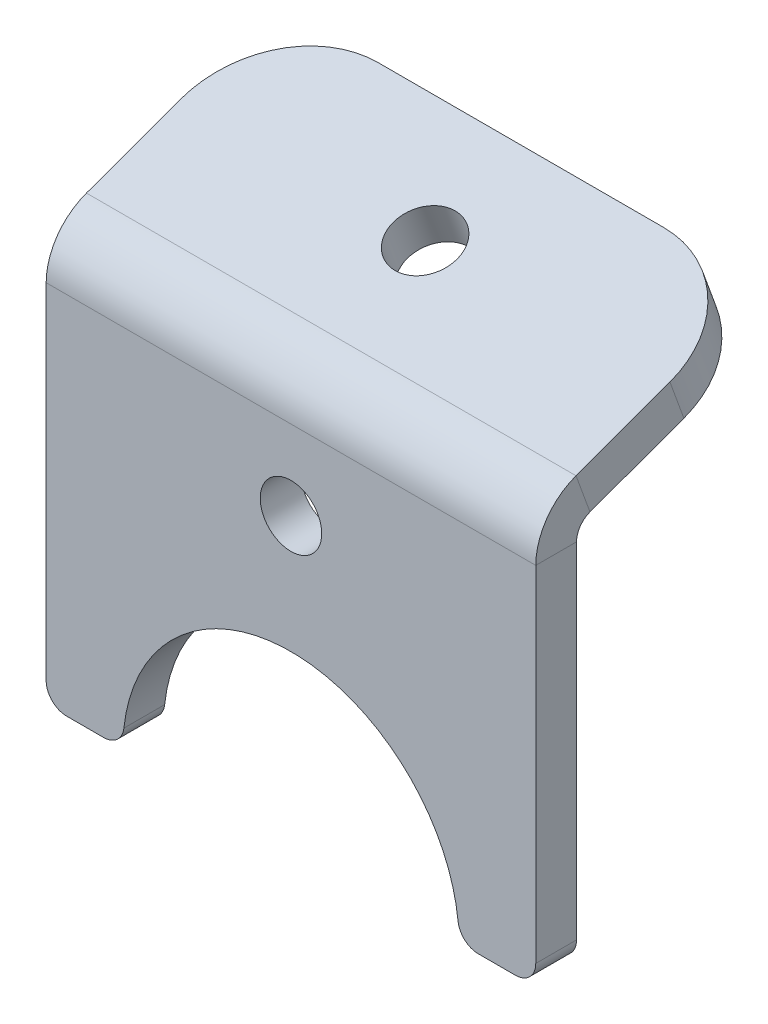
ISO-10303-21;
HEADER;
FILE_DESCRIPTION(('STEP AP214'),'2;1');
FILE_NAME('part.step','',(''),(''),'','','');
FILE_SCHEMA(('AUTOMOTIVE_DESIGN { 1 0 10303 214 1 1 1 1 }'));
ENDSEC;
DATA;
#1=APPLICATION_CONTEXT('core data for automotive mechanical design processes');
#2=APPLICATION_PROTOCOL_DEFINITION('international standard','automotive_design',2000,#1);
#3=PRODUCT_CONTEXT('',#1,'mechanical');
#4=PRODUCT('Part','Part','',(#3));
#5=PRODUCT_RELATED_PRODUCT_CATEGORY('part','',(#4));
#6=PRODUCT_DEFINITION_FORMATION('','',#4);
#7=PRODUCT_DEFINITION_CONTEXT('part definition',#1,'design');
#8=PRODUCT_DEFINITION('design','',#6,#7);
#9=PRODUCT_DEFINITION_SHAPE('','',#8);
#10=(LENGTH_UNIT() NAMED_UNIT(*) SI_UNIT(.MILLI.,.METRE.));
#11=(NAMED_UNIT(*) PLANE_ANGLE_UNIT() SI_UNIT($,.RADIAN.));
#12=(NAMED_UNIT(*) SI_UNIT($,.STERADIAN.) SOLID_ANGLE_UNIT());
#13=UNCERTAINTY_MEASURE_WITH_UNIT(LENGTH_MEASURE(1.E-05),#10,'distance_accuracy_value','');
#14=(GEOMETRIC_REPRESENTATION_CONTEXT(3) GLOBAL_UNCERTAINTY_ASSIGNED_CONTEXT((#13)) GLOBAL_UNIT_ASSIGNED_CONTEXT((#10,
#11,#12)) REPRESENTATION_CONTEXT('',''));
#15=CARTESIAN_POINT('',(0.,0.,0.));
#16=DIRECTION('',(0.,0.,1.));
#17=DIRECTION('',(1.,0.,0.));
#18=AXIS2_PLACEMENT_3D('',#15,#16,#17);
#19=CARTESIAN_POINT('',(38.1,0.,-6.35));
#20=DIRECTION('',(0.,-1.,0.));
#21=DIRECTION('',(0.,0.,-1.));
#22=AXIS2_PLACEMENT_3D('',#19,#20,#21);
#23=PLANE('',#22);
#24=DIRECTION('',(-1.,0.,0.));
#25=VECTOR('',#24,1.);
#26=CARTESIAN_POINT('',(38.1,0.,0.));
#27=LINE('',#26,#25);
#28=CARTESIAN_POINT('',(34.925,0.,0.));
#29=VERTEX_POINT('',#28);
#30=CARTESIAN_POINT('',(29.1646865918357,0.,0.));
#31=VERTEX_POINT('',#30);
#32=EDGE_CURVE('E225',#29,#31,#27,.T.);
#33=ORIENTED_EDGE('',*,*,#32,.T.);
#34=DIRECTION('',(0.,0.,-1.));
#35=VECTOR('',#34,1.);
#36=CARTESIAN_POINT('',(29.1646865918357,0.,-6.34999999999999));
#37=LINE('',#36,#35);
#38=CARTESIAN_POINT('',(29.1646865918357,0.,-6.35));
#39=VERTEX_POINT('',#38);
#40=EDGE_CURVE('E46',#31,#39,#37,.T.);
#41=ORIENTED_EDGE('',*,*,#40,.T.);
#42=DIRECTION('',(-1.,0.,0.));
#43=VECTOR('',#42,1.);
#44=CARTESIAN_POINT('',(38.1,0.,-6.35));
#45=LINE('',#44,#43);
#46=CARTESIAN_POINT('',(34.925,0.,-6.35));
#47=VERTEX_POINT('',#46);
#48=EDGE_CURVE('E222',#47,#39,#45,.T.);
#49=ORIENTED_EDGE('',*,*,#48,.F.);
#50=DIRECTION('',(0.,0.,1.));
#51=VECTOR('',#50,1.);
#52=CARTESIAN_POINT('',(34.925,0.,-6.35));
#53=LINE('',#52,#51);
#54=EDGE_CURVE('E286',#47,#29,#53,.T.);
#55=ORIENTED_EDGE('',*,*,#54,.T.);
#56=EDGE_LOOP('',(#33,#41,#49,#55));
#57=FACE_BOUND('',#56,.T.);
#58=ADVANCED_FACE('F38',(#57),#23,.T.);
#59=CARTESIAN_POINT('',(38.1,65.7810954115383,-6.26725813482301));
#60=DIRECTION('',(1.,0.,0.));
#61=DIRECTION('',(0.,0.,-1.));
#62=AXIS2_PLACEMENT_3D('',#59,#60,#61);
#63=PLANE('',#62);
#64=DIRECTION('',(0.,-0.939692620785909,-0.342020143325667));
#65=VECTOR('',#64,1.);
#66=CARTESIAN_POINT('',(38.1,65.7810954115383,-6.26725813482301));
#67=LINE('',#66,#65);
#68=CARTESIAN_POINT('',(38.1,65.7810954115383,-6.26725813482301));
#69=VERTEX_POINT('',#68);
#70=CARTESIAN_POINT('',(38.1,59.8140472695477,-8.439086044941));
#71=VERTEX_POINT('',#70);
#72=EDGE_CURVE('E163',#69,#71,#67,.T.);
#73=ORIENTED_EDGE('',*,*,#72,.F.);
#74=CARTESIAN_POINT('',(38.1,56.8305231985525,-9.525));
#75=DIRECTION('',(-1.,0.,0.));
#76=DIRECTION('',(0.,0.,1.));
#77=AXIS2_PLACEMENT_3D('',#74,#75,#76);
#78=CIRCLE('',#77,9.525);
#79=CARTESIAN_POINT('',(38.1,56.8305231985525,0.));
#80=VERTEX_POINT('',#79);
#81=EDGE_CURVE('E158',#69,#80,#78,.F.);
#82=ORIENTED_EDGE('',*,*,#81,.T.);
#83=DIRECTION('',(0.,0.,1.));
#84=VECTOR('',#83,1.);
#85=CARTESIAN_POINT('',(38.1,56.8305231985525,-6.35));
#86=LINE('',#85,#84);
#87=CARTESIAN_POINT('',(38.1,56.8305231985525,-6.35));
#88=VERTEX_POINT('',#87);
#89=EDGE_CURVE('E151',#88,#80,#86,.T.);
#90=ORIENTED_EDGE('',*,*,#89,.F.);
#91=CARTESIAN_POINT('',(38.1,56.8305231985525,-9.525));
#92=DIRECTION('',(1.,0.,0.));
#93=DIRECTION('',(0.,0.,-1.));
#94=AXIS2_PLACEMENT_3D('',#91,#92,#93);
#95=CIRCLE('',#94,3.175);
#96=EDGE_CURVE('E156',#71,#88,#95,.T.);
#97=ORIENTED_EDGE('',*,*,#96,.F.);
#98=EDGE_LOOP('',(#73,#82,#90,#97));
#99=FACE_BOUND('',#98,.T.);
#100=ADVANCED_FACE('F154',(#99),#63,.T.);
#101=CARTESIAN_POINT('',(38.1,56.8305231985525,-6.35));
#102=DIRECTION('',(1.,0.,0.));
#103=DIRECTION('',(0.,0.,-1.));
#104=AXIS2_PLACEMENT_3D('',#101,#102,#103);
#105=PLANE('',#104);
#106=DIRECTION('',(0.,-0.342020143325666,0.93969262078591));
#107=VECTOR('',#106,1.);
#108=CARTESIAN_POINT('',(38.1,70.5639193187174,-37.9741167620611));
#109=LINE('',#108,#107);
#110=CARTESIAN_POINT('',(38.1,65.1343495434224,-23.0564964070848));
#111=VERTEX_POINT('',#110);
#112=EDGE_CURVE('E187',#111,#71,#109,.T.);
#113=ORIENTED_EDGE('',*,*,#112,.F.);
#114=DIRECTION('',(0.,-0.93969262078591,-0.342020143325666));
#115=VECTOR('',#114,1.);
#116=CARTESIAN_POINT('',(38.1,63.1712508028045,-23.7710059155952));
#117=LINE('',#116,#115);
#118=CARTESIAN_POINT('',(38.1,71.1013976854129,-20.8846684969668));
#119=VERTEX_POINT('',#118);
#120=EDGE_CURVE('E256',#111,#119,#117,.F.);
#121=ORIENTED_EDGE('',*,*,#120,.T.);
#122=DIRECTION('',(0.,-0.342020143325666,0.93969262078591));
#123=VECTOR('',#122,1.);
#124=CARTESIAN_POINT('',(38.1,76.5309674607079,-35.8022888519431));
#125=LINE('',#124,#123);
#126=EDGE_CURVE('E189',#119,#69,#125,.T.);
#127=ORIENTED_EDGE('',*,*,#126,.T.);
#128=ORIENTED_EDGE('',*,*,#72,.T.);
#129=EDGE_LOOP('',(#113,#121,#127,#128));
#130=FACE_BOUND('',#129,.T.);
#131=ADVANCED_FACE('F366',(#130),#105,.T.);
#132=CARTESIAN_POINT('',(-38.1,56.8305231985525,0.));
#133=DIRECTION('',(-1.,0.,0.));
#134=DIRECTION('',(0.,0.,1.));
#135=AXIS2_PLACEMENT_3D('',#132,#133,#134);
#136=PLANE('',#135);
#137=DIRECTION('',(0.,0.,-1.));
#138=VECTOR('',#137,1.);
#139=CARTESIAN_POINT('',(-38.1,56.8305231985525,0.));
#140=LINE('',#139,#138);
#141=CARTESIAN_POINT('',(-38.1,56.8305231985525,0.));
#142=VERTEX_POINT('',#141);
#143=CARTESIAN_POINT('',(-38.1,56.8305231985525,-6.35));
#144=VERTEX_POINT('',#143);
#145=EDGE_CURVE('E164',#142,#144,#140,.T.);
#146=ORIENTED_EDGE('',*,*,#145,.F.);
#147=CARTESIAN_POINT('',(-38.1,56.8305231985525,-9.525));
#148=DIRECTION('',(-1.,0.,0.));
#149=DIRECTION('',(0.,0.,1.));
#150=AXIS2_PLACEMENT_3D('',#147,#148,#149);
#151=CIRCLE('',#150,9.525);
#152=CARTESIAN_POINT('',(-38.1,65.7810954115383,-6.26725813482301));
#153=VERTEX_POINT('',#152);
#154=EDGE_CURVE('E207',#153,#142,#151,.F.);
#155=ORIENTED_EDGE('',*,*,#154,.F.);
#156=DIRECTION('',(0.,0.939692620785909,0.342020143325667));
#157=VECTOR('',#156,1.);
#158=CARTESIAN_POINT('',(-38.1,59.8140472695477,-8.439086044941));
#159=LINE('',#158,#157);
#160=CARTESIAN_POINT('',(-38.1,59.8140472695477,-8.439086044941));
#161=VERTEX_POINT('',#160);
#162=EDGE_CURVE('E227',#161,#153,#159,.T.);
#163=ORIENTED_EDGE('',*,*,#162,.F.);
#164=CARTESIAN_POINT('',(-38.1,56.8305231985525,-9.525));
#165=DIRECTION('',(1.,0.,0.));
#166=DIRECTION('',(0.,0.,-1.));
#167=AXIS2_PLACEMENT_3D('',#164,#165,#166);
#168=CIRCLE('',#167,3.175);
#169=EDGE_CURVE('E201',#161,#144,#168,.T.);
#170=ORIENTED_EDGE('',*,*,#169,.T.);
#171=EDGE_LOOP('',(#146,#155,#163,#170));
#172=FACE_BOUND('',#171,.T.);
#173=ADVANCED_FACE('F323',(#172),#136,.T.);
#174=CARTESIAN_POINT('',(-38.1,59.8140472695477,-8.439086044941));
#175=DIRECTION('',(-1.,0.,0.));
#176=DIRECTION('',(0.,0.,1.));
#177=AXIS2_PLACEMENT_3D('',#174,#175,#176);
#178=PLANE('',#177);
#179=DIRECTION('',(0.,-1.,0.));
#180=VECTOR('',#179,1.);
#181=CARTESIAN_POINT('',(-38.1,63.5,-6.35));
#182=LINE('',#181,#180);
#183=CARTESIAN_POINT('',(-38.1,3.175,-6.35));
#184=VERTEX_POINT('',#183);
#185=EDGE_CURVE('E173',#144,#184,#182,.T.);
#186=ORIENTED_EDGE('',*,*,#185,.T.);
#187=DIRECTION('',(0.,0.,1.));
#188=VECTOR('',#187,1.);
#189=CARTESIAN_POINT('',(-38.1,3.175,-8.439086044941));
#190=LINE('',#189,#188);
#191=CARTESIAN_POINT('',(-38.1,3.175,0.));
#192=VERTEX_POINT('',#191);
#193=EDGE_CURVE('E258',#184,#192,#190,.T.);
#194=ORIENTED_EDGE('',*,*,#193,.T.);
#195=DIRECTION('',(0.,-1.,0.));
#196=VECTOR('',#195,1.);
#197=CARTESIAN_POINT('',(-38.1,63.5,0.));
#198=LINE('',#197,#196);
#199=EDGE_CURVE('E196',#142,#192,#198,.T.);
#200=ORIENTED_EDGE('',*,*,#199,.F.);
#201=ORIENTED_EDGE('',*,*,#145,.T.);
#202=EDGE_LOOP('',(#186,#194,#200,#201));
#203=FACE_BOUND('',#202,.T.);
#204=ADVANCED_FACE('F319',(#203),#178,.T.);
#205=CARTESIAN_POINT('',(38.1,63.5,0.));
#206=DIRECTION('',(0.,0.,-1.));
#207=DIRECTION('',(0.,1.,0.));
#208=AXIS2_PLACEMENT_3D('',#205,#206,#207);
#209=PLANE('',#208);
#210=CARTESIAN_POINT('',(0.,44.45,0.));
#211=DIRECTION('',(0.,0.,1.));
#212=DIRECTION('',(1.,0.,0.));
#213=AXIS2_PLACEMENT_3D('',#210,#211,#212);
#214=CIRCLE('',#213,4.7879);
#215=CARTESIAN_POINT('',(4.7879,44.45,0.));
#216=VERTEX_POINT('',#215);
#217=EDGE_CURVE('E240',#216,#216,#214,.T.);
#218=ORIENTED_EDGE('',*,*,#217,.F.);
#219=EDGE_LOOP('',(#218));
#220=FACE_BOUND('',#219,.T.);
#221=ORIENTED_EDGE('',*,*,#199,.T.);
#222=CARTESIAN_POINT('',(-34.925,3.175,0.));
#223=DIRECTION('',(0.,0.,-1.));
#224=DIRECTION('',(0.,1.,0.));
#225=AXIS2_PLACEMENT_3D('',#222,#223,#224);
#226=CIRCLE('',#225,3.175);
#227=CARTESIAN_POINT('',(-34.925,0.,0.));
#228=VERTEX_POINT('',#227);
#229=EDGE_CURVE('E267',#192,#228,#226,.F.);
#230=ORIENTED_EDGE('',*,*,#229,.T.);
#231=CARTESIAN_POINT('',(-29.1646865918357,0.,0.));
#232=VERTEX_POINT('',#231);
#233=EDGE_CURVE('E224',#232,#228,#27,.T.);
#234=ORIENTED_EDGE('',*,*,#233,.F.);
#235=CARTESIAN_POINT('',(-29.1646865918357,3.175,0.));
#236=DIRECTION('',(0.,0.,-1.));
#237=DIRECTION('',(0.,1.,0.));
#238=AXIS2_PLACEMENT_3D('',#235,#236,#237);
#239=CIRCLE('',#238,3.175);
#240=CARTESIAN_POINT('',(-26.0083352290829,2.83138528138528,0.));
#241=VERTEX_POINT('',#240);
#242=EDGE_CURVE('E265',#232,#241,#239,.F.);
#243=ORIENTED_EDGE('',*,*,#242,.T.);
#244=CARTESIAN_POINT('',(0.,0.,0.));
#245=DIRECTION('',(0.,0.,1.));
#246=DIRECTION('',(1.,0.,0.));
#247=AXIS2_PLACEMENT_3D('',#244,#245,#246);
#248=CIRCLE('',#247,26.162);
#249=CARTESIAN_POINT('',(26.0083352290829,2.83138528138528,0.));
#250=VERTEX_POINT('',#249);
#251=EDGE_CURVE('E199',#250,#241,#248,.T.);
#252=ORIENTED_EDGE('',*,*,#251,.F.);
#253=CARTESIAN_POINT('',(29.1646865918357,3.175,0.));
#254=DIRECTION('',(0.,0.,-1.));
#255=DIRECTION('',(0.,1.,0.));
#256=AXIS2_PLACEMENT_3D('',#253,#254,#255);
#257=CIRCLE('',#256,3.175);
#258=EDGE_CURVE('E263',#250,#31,#257,.F.);
#259=ORIENTED_EDGE('',*,*,#258,.T.);
#260=ORIENTED_EDGE('',*,*,#32,.F.);
#261=CARTESIAN_POINT('',(34.925,3.175,0.));
#262=DIRECTION('',(0.,0.,-1.));
#263=DIRECTION('',(0.,1.,0.));
#264=AXIS2_PLACEMENT_3D('',#261,#262,#263);
#265=CIRCLE('',#264,3.175);
#266=CARTESIAN_POINT('',(38.1,3.175,0.));
#267=VERTEX_POINT('',#266);
#268=EDGE_CURVE('E261',#29,#267,#265,.F.);
#269=ORIENTED_EDGE('',*,*,#268,.T.);
#270=DIRECTION('',(0.,-1.,0.));
#271=VECTOR('',#270,1.);
#272=CARTESIAN_POINT('',(38.1,63.5,0.));
#273=LINE('',#272,#271);
#274=EDGE_CURVE('E182',#80,#267,#273,.T.);
#275=ORIENTED_EDGE('',*,*,#274,.F.);
#276=DIRECTION('',(-1.,0.,0.));
#277=VECTOR('',#276,1.);
#278=CARTESIAN_POINT('',(38.1,56.8305231985525,0.));
#279=LINE('',#278,#277);
#280=EDGE_CURVE('E195',#80,#142,#279,.T.);
#281=ORIENTED_EDGE('',*,*,#280,.T.);
#282=EDGE_LOOP('',(#221,#230,#234,#243,#252,#259,#260,#269,#275,#281));
#283=FACE_BOUND('',#282,.T.);
#284=ADVANCED_FACE('F292',(#220,#283),#209,.F.);
#285=ORIENTED_EDGE('',*,*,#233,.T.);
#286=DIRECTION('',(0.,0.,1.));
#287=VECTOR('',#286,1.);
#288=CARTESIAN_POINT('',(-34.925,0.,-6.35));
#289=LINE('',#288,#287);
#290=CARTESIAN_POINT('',(-34.925,0.,-6.35));
#291=VERTEX_POINT('',#290);
#292=EDGE_CURVE('E271',#228,#291,#289,.F.);
#293=ORIENTED_EDGE('',*,*,#292,.T.);
#294=CARTESIAN_POINT('',(-29.1646865918357,0.,-6.35));
#295=VERTEX_POINT('',#294);
#296=EDGE_CURVE('E177',#295,#291,#45,.T.);
#297=ORIENTED_EDGE('',*,*,#296,.F.);
#298=DIRECTION('',(0.,0.,-1.));
#299=VECTOR('',#298,1.);
#300=CARTESIAN_POINT('',(-29.1646865918357,0.,0.));
#301=LINE('',#300,#299);
#302=EDGE_CURVE('E269',#295,#232,#301,.F.);
#303=ORIENTED_EDGE('',*,*,#302,.T.);
#304=EDGE_LOOP('',(#285,#293,#297,#303));
#305=FACE_BOUND('',#304,.T.);
#306=ADVANCED_FACE('F310',(#305),#23,.T.);
#307=CARTESIAN_POINT('',(38.1,63.5,-6.35));
#308=DIRECTION('',(0.,0.,-1.));
#309=DIRECTION('',(0.,1.,0.));
#310=AXIS2_PLACEMENT_3D('',#307,#308,#309);
#311=PLANE('',#310);
#312=CARTESIAN_POINT('',(0.,44.45,-6.34999999999999));
#313=DIRECTION('',(0.,0.,-1.));
#314=DIRECTION('',(0.,1.,0.));
#315=AXIS2_PLACEMENT_3D('',#312,#313,#314);
#316=CIRCLE('',#315,4.7879);
#317=CARTESIAN_POINT('',(0.,49.2379,-6.34999999999999));
#318=VERTEX_POINT('',#317);
#319=EDGE_CURVE('E237',#318,#318,#316,.T.);
#320=ORIENTED_EDGE('',*,*,#319,.F.);
#321=EDGE_LOOP('',(#320));
#322=FACE_BOUND('',#321,.T.);
#323=ORIENTED_EDGE('',*,*,#296,.T.);
#324=CARTESIAN_POINT('',(-34.925,3.175,-6.35));
#325=DIRECTION('',(0.,0.,-1.));
#326=DIRECTION('',(0.,1.,0.));
#327=AXIS2_PLACEMENT_3D('',#324,#325,#326);
#328=CIRCLE('',#327,3.175);
#329=EDGE_CURVE('E278',#291,#184,#328,.T.);
#330=ORIENTED_EDGE('',*,*,#329,.T.);
#331=ORIENTED_EDGE('',*,*,#185,.F.);
#332=DIRECTION('',(-1.,0.,0.));
#333=VECTOR('',#332,1.);
#334=CARTESIAN_POINT('',(38.1,56.8305231985525,-6.35));
#335=LINE('',#334,#333);
#336=EDGE_CURVE('E168',#88,#144,#335,.T.);
#337=ORIENTED_EDGE('',*,*,#336,.F.);
#338=DIRECTION('',(0.,-1.,0.));
#339=VECTOR('',#338,1.);
#340=CARTESIAN_POINT('',(38.1,63.5,-6.35));
#341=LINE('',#340,#339);
#342=CARTESIAN_POINT('',(38.1,3.175,-6.35));
#343=VERTEX_POINT('',#342);
#344=EDGE_CURVE('E171',#88,#343,#341,.T.);
#345=ORIENTED_EDGE('',*,*,#344,.T.);
#346=CARTESIAN_POINT('',(34.925,3.175,-6.35));
#347=DIRECTION('',(0.,0.,-1.));
#348=DIRECTION('',(0.,1.,0.));
#349=AXIS2_PLACEMENT_3D('',#346,#347,#348);
#350=CIRCLE('',#349,3.175);
#351=EDGE_CURVE('E59',#343,#47,#350,.T.);
#352=ORIENTED_EDGE('',*,*,#351,.T.);
#353=ORIENTED_EDGE('',*,*,#48,.T.);
#354=CARTESIAN_POINT('',(29.1646865918357,3.175,-6.34999999999999));
#355=DIRECTION('',(0.,0.,-1.));
#356=DIRECTION('',(0.,1.,0.));
#357=AXIS2_PLACEMENT_3D('',#354,#355,#356);
#358=CIRCLE('',#357,3.175);
#359=CARTESIAN_POINT('',(26.0083352290829,2.83138528138528,-6.34999999999999));
#360=VERTEX_POINT('',#359);
#361=EDGE_CURVE('E274',#39,#360,#358,.T.);
#362=ORIENTED_EDGE('',*,*,#361,.T.);
#363=CARTESIAN_POINT('',(0.,0.,-6.34999999999999));
#364=DIRECTION('',(0.,0.,-1.));
#365=DIRECTION('',(0.,1.,0.));
#366=AXIS2_PLACEMENT_3D('',#363,#364,#365);
#367=CIRCLE('',#366,26.162);
#368=CARTESIAN_POINT('',(-26.0083352290829,2.83138528138528,-6.34999999999999));
#369=VERTEX_POINT('',#368);
#370=EDGE_CURVE('E233',#369,#360,#367,.T.);
#371=ORIENTED_EDGE('',*,*,#370,.F.);
#372=CARTESIAN_POINT('',(-29.1646865918357,3.175,-6.34999999999999));
#373=DIRECTION('',(0.,0.,-1.));
#374=DIRECTION('',(0.,1.,0.));
#375=AXIS2_PLACEMENT_3D('',#372,#373,#374);
#376=CIRCLE('',#375,3.175);
#377=EDGE_CURVE('E276',#369,#295,#376,.T.);
#378=ORIENTED_EDGE('',*,*,#377,.T.);
#379=EDGE_LOOP('',(#323,#330,#331,#337,#345,#352,#353,#362,#371,#378));
#380=FACE_BOUND('',#379,.T.);
#381=ADVANCED_FACE('F170',(#322,#380),#311,.T.);
#382=CARTESIAN_POINT('',(38.1,56.8305231985525,-9.525));
#383=DIRECTION('',(-1.,0.,0.));
#384=DIRECTION('',(0.,0.,1.));
#385=AXIS2_PLACEMENT_3D('',#382,#383,#384);
#386=CYLINDRICAL_SURFACE('',#385,3.175);
#387=ORIENTED_EDGE('',*,*,#169,.F.);
#388=DIRECTION('',(-1.,0.,0.));
#389=VECTOR('',#388,1.);
#390=CARTESIAN_POINT('',(38.1,59.8140472695477,-8.439086044941));
#391=LINE('',#390,#389);
#392=EDGE_CURVE('E178',#71,#161,#391,.T.);
#393=ORIENTED_EDGE('',*,*,#392,.F.);
#394=ORIENTED_EDGE('',*,*,#96,.T.);
#395=ORIENTED_EDGE('',*,*,#336,.T.);
#396=EDGE_LOOP('',(#387,#393,#394,#395));
#397=FACE_BOUND('',#396,.T.);
#398=ADVANCED_FACE('F185',(#397),#386,.F.);
#399=CARTESIAN_POINT('',(38.1,70.5639193187174,-37.9741167620611));
#400=DIRECTION('',(0.,-0.939692620785909,-0.342020143325666));
#401=DIRECTION('',(0.,0.342020143325666,-0.93969262078591));
#402=AXIS2_PLACEMENT_3D('',#399,#400,#401);
#403=PLANE('',#402);
#404=CARTESIAN_POINT('',(0.,65.1343495434224,-23.0564964070848));
#405=DIRECTION('',(0.,-0.939692620785909,-0.342020143325666));
#406=DIRECTION('',(0.,0.342020143325666,-0.93969262078591));
#407=AXIS2_PLACEMENT_3D('',#404,#405,#406);
#408=CIRCLE('',#407,4.9657);
#409=CARTESIAN_POINT('',(0.,66.8327189691347,-27.7227280541214));
#410=VERTEX_POINT('',#409);
#411=EDGE_CURVE('E332',#410,#410,#408,.T.);
#412=ORIENTED_EDGE('',*,*,#411,.F.);
#413=EDGE_LOOP('',(#412));
#414=FACE_BOUND('',#413,.T.);
#415=DIRECTION('',(0.,-0.342020143325666,0.93969262078591));
#416=VECTOR('',#415,1.);
#417=CARTESIAN_POINT('',(-38.1,70.5639193187174,-37.9741167620611));
#418=LINE('',#417,#416);
#419=CARTESIAN_POINT('',(-38.1,65.1343495434224,-23.0564964070848));
#420=VERTEX_POINT('',#419);
#421=EDGE_CURVE('E203',#420,#161,#418,.T.);
#422=ORIENTED_EDGE('',*,*,#421,.F.);
#423=CARTESIAN_POINT('',(-22.225,65.1343495434224,-23.0564964070848));
#424=DIRECTION('',(0.,-0.939692620785909,-0.342020143325666));
#425=DIRECTION('',(0.,0.342020143325666,-0.93969262078591));
#426=AXIS2_PLACEMENT_3D('',#423,#424,#425);
#427=CIRCLE('',#426,15.875);
#428=CARTESIAN_POINT('',(-22.225,70.5639193187174,-37.9741167620611));
#429=VERTEX_POINT('',#428);
#430=EDGE_CURVE('E245',#420,#429,#427,.T.);
#431=ORIENTED_EDGE('',*,*,#430,.T.);
#432=DIRECTION('',(-1.,0.,0.));
#433=VECTOR('',#432,1.);
#434=CARTESIAN_POINT('',(38.1,70.5639193187174,-37.9741167620611));
#435=LINE('',#434,#433);
#436=CARTESIAN_POINT('',(22.225,70.5639193187174,-37.9741167620611));
#437=VERTEX_POINT('',#436);
#438=EDGE_CURVE('E218',#437,#429,#435,.T.);
#439=ORIENTED_EDGE('',*,*,#438,.F.);
#440=CARTESIAN_POINT('',(22.225,65.1343495434224,-23.0564964070848));
#441=DIRECTION('',(0.,-0.939692620785909,-0.342020143325666));
#442=DIRECTION('',(0.,0.342020143325666,-0.93969262078591));
#443=AXIS2_PLACEMENT_3D('',#440,#441,#442);
#444=CIRCLE('',#443,15.875);
#445=EDGE_CURVE('E243',#437,#111,#444,.T.);
#446=ORIENTED_EDGE('',*,*,#445,.T.);
#447=ORIENTED_EDGE('',*,*,#112,.T.);
#448=ORIENTED_EDGE('',*,*,#392,.T.);
#449=EDGE_LOOP('',(#422,#431,#439,#446,#447,#448));
#450=FACE_BOUND('',#449,.T.);
#451=ADVANCED_FACE('F361',(#414,#450),#403,.T.);
#452=CARTESIAN_POINT('',(38.1,76.5309674607079,-35.8022888519431));
#453=DIRECTION('',(0.,0.342020143325666,-0.93969262078591));
#454=DIRECTION('',(0.,0.93969262078591,0.342020143325666));
#455=AXIS2_PLACEMENT_3D('',#452,#453,#454);
#456=PLANE('',#455);
#457=ORIENTED_EDGE('',*,*,#438,.T.);
#458=DIRECTION('',(0.,-0.93969262078591,-0.342020143325666));
#459=VECTOR('',#458,1.);
#460=CARTESIAN_POINT('',(-22.225,76.5309674607079,-35.8022888519431));
#461=LINE('',#460,#459);
#462=CARTESIAN_POINT('',(-22.225,76.5309674607079,-35.8022888519431));
#463=VERTEX_POINT('',#462);
#464=EDGE_CURVE('E250',#429,#463,#461,.F.);
#465=ORIENTED_EDGE('',*,*,#464,.T.);
#466=DIRECTION('',(-1.,0.,0.));
#467=VECTOR('',#466,1.);
#468=CARTESIAN_POINT('',(38.1,76.5309674607079,-35.8022888519431));
#469=LINE('',#468,#467);
#470=CARTESIAN_POINT('',(22.225,76.5309674607079,-35.8022888519431));
#471=VERTEX_POINT('',#470);
#472=EDGE_CURVE('E215',#471,#463,#469,.T.);
#473=ORIENTED_EDGE('',*,*,#472,.F.);
#474=DIRECTION('',(0.,-0.93969262078591,-0.342020143325666));
#475=VECTOR('',#474,1.);
#476=CARTESIAN_POINT('',(22.225,76.5309674607079,-35.8022888519431));
#477=LINE('',#476,#475);
#478=EDGE_CURVE('E247',#471,#437,#477,.T.);
#479=ORIENTED_EDGE('',*,*,#478,.T.);
#480=EDGE_LOOP('',(#457,#465,#473,#479));
#481=FACE_BOUND('',#480,.T.);
#482=ADVANCED_FACE('F344',(#481),#456,.T.);
#483=CARTESIAN_POINT('',(38.1,76.5309674607079,-35.8022888519431));
#484=DIRECTION('',(0.,-0.939692620785909,-0.342020143325666));
#485=DIRECTION('',(0.,0.342020143325666,-0.93969262078591));
#486=AXIS2_PLACEMENT_3D('',#483,#484,#485);
#487=PLANE('',#486);
#488=CARTESIAN_POINT('',(0.,71.1013976854129,-20.8846684969668));
#489=DIRECTION('',(0.,0.939692620785909,0.342020143325666));
#490=DIRECTION('',(0.,-0.342020143325666,0.939692620785909));
#491=AXIS2_PLACEMENT_3D('',#488,#489,#490);
#492=CIRCLE('',#491,4.9657);
#493=CARTESIAN_POINT('',(0.,69.4030282597007,-16.2184368499302));
#494=VERTEX_POINT('',#493);
#495=EDGE_CURVE('E335',#494,#494,#492,.T.);
#496=ORIENTED_EDGE('',*,*,#495,.F.);
#497=EDGE_LOOP('',(#496));
#498=FACE_BOUND('',#497,.T.);
#499=ORIENTED_EDGE('',*,*,#472,.T.);
#500=CARTESIAN_POINT('',(-22.225,71.1013976854129,-20.8846684969668));
#501=DIRECTION('',(0.,-0.939692620785909,-0.342020143325666));
#502=DIRECTION('',(0.,0.342020143325666,-0.93969262078591));
#503=AXIS2_PLACEMENT_3D('',#500,#501,#502);
#504=CIRCLE('',#503,15.875);
#505=CARTESIAN_POINT('',(-38.1,71.1013976854129,-20.8846684969668));
#506=VERTEX_POINT('',#505);
#507=EDGE_CURVE('E254',#463,#506,#504,.F.);
#508=ORIENTED_EDGE('',*,*,#507,.T.);
#509=DIRECTION('',(0.,-0.342020143325666,0.93969262078591));
#510=VECTOR('',#509,1.);
#511=CARTESIAN_POINT('',(-38.1,76.5309674607079,-35.8022888519431));
#512=LINE('',#511,#510);
#513=EDGE_CURVE('E205',#506,#153,#512,.T.);
#514=ORIENTED_EDGE('',*,*,#513,.T.);
#515=DIRECTION('',(-1.,0.,0.));
#516=VECTOR('',#515,1.);
#517=CARTESIAN_POINT('',(38.1,65.7810954115383,-6.26725813482301));
#518=LINE('',#517,#516);
#519=EDGE_CURVE('E212',#69,#153,#518,.T.);
#520=ORIENTED_EDGE('',*,*,#519,.F.);
#521=ORIENTED_EDGE('',*,*,#126,.F.);
#522=CARTESIAN_POINT('',(22.225,71.1013976854129,-20.8846684969668));
#523=DIRECTION('',(0.,-0.939692620785909,-0.342020143325666));
#524=DIRECTION('',(0.,0.342020143325666,-0.93969262078591));
#525=AXIS2_PLACEMENT_3D('',#522,#523,#524);
#526=CIRCLE('',#525,15.875);
#527=EDGE_CURVE('E252',#119,#471,#526,.F.);
#528=ORIENTED_EDGE('',*,*,#527,.T.);
#529=EDGE_LOOP('',(#499,#508,#514,#520,#521,#528));
#530=FACE_BOUND('',#529,.T.);
#531=ADVANCED_FACE('F341',(#498,#530),#487,.F.);
#532=CARTESIAN_POINT('',(38.1,56.8305231985525,-9.525));
#533=DIRECTION('',(-1.,0.,0.));
#534=DIRECTION('',(0.,0.,1.));
#535=AXIS2_PLACEMENT_3D('',#532,#533,#534);
#536=CYLINDRICAL_SURFACE('',#535,9.525);
#537=ORIENTED_EDGE('',*,*,#154,.T.);
#538=ORIENTED_EDGE('',*,*,#280,.F.);
#539=ORIENTED_EDGE('',*,*,#81,.F.);
#540=ORIENTED_EDGE('',*,*,#519,.T.);
#541=EDGE_LOOP('',(#537,#538,#539,#540));
#542=FACE_BOUND('',#541,.T.);
#543=ADVANCED_FACE('F326',(#542),#536,.T.);
#544=CARTESIAN_POINT('',(38.1,56.8305231985525,-9.525));
#545=DIRECTION('',(1.,0.,0.));
#546=DIRECTION('',(0.,0.,-1.));
#547=AXIS2_PLACEMENT_3D('',#544,#545,#546);
#548=PLANE('',#547);
#549=ORIENTED_EDGE('',*,*,#274,.T.);
#550=DIRECTION('',(0.,0.,1.));
#551=VECTOR('',#550,1.);
#552=CARTESIAN_POINT('',(38.1,3.175,-9.525));
#553=LINE('',#552,#551);
#554=EDGE_CURVE('E11',#267,#343,#553,.F.);
#555=ORIENTED_EDGE('',*,*,#554,.T.);
#556=ORIENTED_EDGE('',*,*,#344,.F.);
#557=ORIENTED_EDGE('',*,*,#89,.T.);
#558=EDGE_LOOP('',(#549,#555,#556,#557));
#559=FACE_BOUND('',#558,.T.);
#560=ADVANCED_FACE('F180',(#559),#548,.T.);
#561=CARTESIAN_POINT('',(-38.1,56.8305231985525,-9.525));
#562=DIRECTION('',(1.,0.,0.));
#563=DIRECTION('',(0.,0.,-1.));
#564=AXIS2_PLACEMENT_3D('',#561,#562,#563);
#565=PLANE('',#564);
#566=ORIENTED_EDGE('',*,*,#513,.F.);
#567=DIRECTION('',(0.,-0.93969262078591,-0.342020143325666));
#568=VECTOR('',#567,1.);
#569=CARTESIAN_POINT('',(-38.1,65.1343495434224,-23.0564964070848));
#570=LINE('',#569,#568);
#571=EDGE_CURVE('E236',#506,#420,#570,.T.);
#572=ORIENTED_EDGE('',*,*,#571,.T.);
#573=ORIENTED_EDGE('',*,*,#421,.T.);
#574=ORIENTED_EDGE('',*,*,#162,.T.);
#575=EDGE_LOOP('',(#566,#572,#573,#574));
#576=FACE_BOUND('',#575,.T.);
#577=ADVANCED_FACE('F359',(#576),#565,.F.);
#578=CARTESIAN_POINT('',(0.,0.,-37.9741167620611));
#579=DIRECTION('',(0.,0.,1.));
#580=DIRECTION('',(1.,0.,0.));
#581=AXIS2_PLACEMENT_3D('',#578,#579,#580);
#582=CYLINDRICAL_SURFACE('',#581,26.162);
#583=ORIENTED_EDGE('',*,*,#251,.T.);
#584=DIRECTION('',(0.,0.,1.));
#585=VECTOR('',#584,1.);
#586=CARTESIAN_POINT('',(-26.0083352290829,2.83138528138528,-37.9741167620611));
#587=LINE('',#586,#585);
#588=EDGE_CURVE('E283',#241,#369,#587,.F.);
#589=ORIENTED_EDGE('',*,*,#588,.T.);
#590=ORIENTED_EDGE('',*,*,#370,.T.);
#591=DIRECTION('',(0.,0.,1.));
#592=VECTOR('',#591,1.);
#593=CARTESIAN_POINT('',(26.0083352290829,2.83138528138528,-37.9741167620611));
#594=LINE('',#593,#592);
#595=EDGE_CURVE('E280',#360,#250,#594,.T.);
#596=ORIENTED_EDGE('',*,*,#595,.T.);
#597=EDGE_LOOP('',(#583,#589,#590,#596));
#598=FACE_BOUND('',#597,.T.);
#599=ADVANCED_FACE('F301',(#598),#582,.F.);
#600=CARTESIAN_POINT('',(0.,44.45,-37.9741167620611));
#601=DIRECTION('',(0.,0.,1.));
#602=DIRECTION('',(1.,0.,0.));
#603=AXIS2_PLACEMENT_3D('',#600,#601,#602);
#604=CYLINDRICAL_SURFACE('',#603,4.7879);
#605=ORIENTED_EDGE('',*,*,#319,.T.);
#606=EDGE_LOOP('',(#605));
#607=FACE_BOUND('',#606,.T.);
#608=ORIENTED_EDGE('',*,*,#217,.T.);
#609=EDGE_LOOP('',(#608));
#610=FACE_BOUND('',#609,.T.);
#611=ADVANCED_FACE('F440',(#607,#610),#604,.F.);
#612=CARTESIAN_POINT('',(0.,2.82484074466394,-45.7353029215807));
#613=DIRECTION('',(0.,0.939692620785909,0.342020143325666));
#614=DIRECTION('',(0.,-0.342020143325666,0.939692620785909));
#615=AXIS2_PLACEMENT_3D('',#612,#613,#614);
#616=CYLINDRICAL_SURFACE('',#615,4.9657);
#617=ORIENTED_EDGE('',*,*,#411,.T.);
#618=EDGE_LOOP('',(#617));
#619=FACE_BOUND('',#618,.T.);
#620=ORIENTED_EDGE('',*,*,#495,.T.);
#621=EDGE_LOOP('',(#620));
#622=FACE_BOUND('',#621,.T.);
#623=ADVANCED_FACE('F339',(#619,#622),#616,.F.);
#624=CARTESIAN_POINT('',(-22.225,62.1508254724271,-24.1424103621438));
#625=DIRECTION('',(0.,0.93969262078591,0.342020143325666));
#626=DIRECTION('',(0.,-0.342020143325666,0.93969262078591));
#627=AXIS2_PLACEMENT_3D('',#624,#625,#626);
#628=CYLINDRICAL_SURFACE('',#627,15.875);
#629=ORIENTED_EDGE('',*,*,#507,.F.);
#630=ORIENTED_EDGE('',*,*,#464,.F.);
#631=ORIENTED_EDGE('',*,*,#430,.F.);
#632=ORIENTED_EDGE('',*,*,#571,.F.);
#633=EDGE_LOOP('',(#629,#630,#631,#632));
#634=FACE_BOUND('',#633,.T.);
#635=ADVANCED_FACE('F356',(#634),#628,.T.);
#636=CARTESIAN_POINT('',(22.225,71.1013976854129,-20.8846684969668));
#637=DIRECTION('',(0.,-0.93969262078591,-0.342020143325666));
#638=DIRECTION('',(0.,0.342020143325666,-0.93969262078591));
#639=AXIS2_PLACEMENT_3D('',#636,#637,#638);
#640=CYLINDRICAL_SURFACE('',#639,15.875);
#641=ORIENTED_EDGE('',*,*,#527,.F.);
#642=ORIENTED_EDGE('',*,*,#120,.F.);
#643=ORIENTED_EDGE('',*,*,#445,.F.);
#644=ORIENTED_EDGE('',*,*,#478,.F.);
#645=EDGE_LOOP('',(#641,#642,#643,#644));
#646=FACE_BOUND('',#645,.T.);
#647=ADVANCED_FACE('F368',(#646),#640,.T.);
#648=CARTESIAN_POINT('',(-34.925,3.175,-8.439086044941));
#649=DIRECTION('',(0.,0.,1.));
#650=DIRECTION('',(1.,0.,0.));
#651=AXIS2_PLACEMENT_3D('',#648,#649,#650);
#652=CYLINDRICAL_SURFACE('',#651,3.175);
#653=ORIENTED_EDGE('',*,*,#329,.F.);
#654=ORIENTED_EDGE('',*,*,#292,.F.);
#655=ORIENTED_EDGE('',*,*,#229,.F.);
#656=ORIENTED_EDGE('',*,*,#193,.F.);
#657=EDGE_LOOP('',(#653,#654,#655,#656));
#658=FACE_BOUND('',#657,.T.);
#659=ADVANCED_FACE('F316',(#658),#652,.T.);
#660=CARTESIAN_POINT('',(-29.1646865918357,3.175,-37.9741167620611));
#661=DIRECTION('',(0.,0.,1.));
#662=DIRECTION('',(1.,0.,0.));
#663=AXIS2_PLACEMENT_3D('',#660,#661,#662);
#664=CYLINDRICAL_SURFACE('',#663,3.175);
#665=ORIENTED_EDGE('',*,*,#242,.F.);
#666=ORIENTED_EDGE('',*,*,#302,.F.);
#667=ORIENTED_EDGE('',*,*,#377,.F.);
#668=ORIENTED_EDGE('',*,*,#588,.F.);
#669=EDGE_LOOP('',(#665,#666,#667,#668));
#670=FACE_BOUND('',#669,.T.);
#671=ADVANCED_FACE('F314',(#670),#664,.T.);
#672=CARTESIAN_POINT('',(29.1646865918357,3.175,-37.9741167620611));
#673=DIRECTION('',(0.,0.,1.));
#674=DIRECTION('',(1.,0.,0.));
#675=AXIS2_PLACEMENT_3D('',#672,#673,#674);
#676=CYLINDRICAL_SURFACE('',#675,3.175);
#677=ORIENTED_EDGE('',*,*,#361,.F.);
#678=ORIENTED_EDGE('',*,*,#40,.F.);
#679=ORIENTED_EDGE('',*,*,#258,.F.);
#680=ORIENTED_EDGE('',*,*,#595,.F.);
#681=EDGE_LOOP('',(#677,#678,#679,#680));
#682=FACE_BOUND('',#681,.T.);
#683=ADVANCED_FACE('F299',(#682),#676,.T.);
#684=CARTESIAN_POINT('',(34.925,3.175,-6.35));
#685=DIRECTION('',(0.,0.,1.));
#686=DIRECTION('',(1.,0.,0.));
#687=AXIS2_PLACEMENT_3D('',#684,#685,#686);
#688=CYLINDRICAL_SURFACE('',#687,3.175);
#689=ORIENTED_EDGE('',*,*,#351,.F.);
#690=ORIENTED_EDGE('',*,*,#554,.F.);
#691=ORIENTED_EDGE('',*,*,#268,.F.);
#692=ORIENTED_EDGE('',*,*,#54,.F.);
#693=EDGE_LOOP('',(#689,#690,#691,#692));
#694=FACE_BOUND('',#693,.T.);
#695=ADVANCED_FACE('F40',(#694),#688,.T.);
#696=CLOSED_SHELL('',(#58,#100,#131,#173,#204,#284,#306,#381,#398,#451,#482,#531,#543,#560,#577,
#599,#611,#623,#635,#647,#659,#671,#683,#695));
#697=MANIFOLD_SOLID_BREP('B2',#696);
#698=ADVANCED_BREP_SHAPE_REPRESENTATION('',(#18,#697),#14);
#699=SHAPE_DEFINITION_REPRESENTATION(#9,#698);
ENDSEC;
END-ISO-10303-21;
